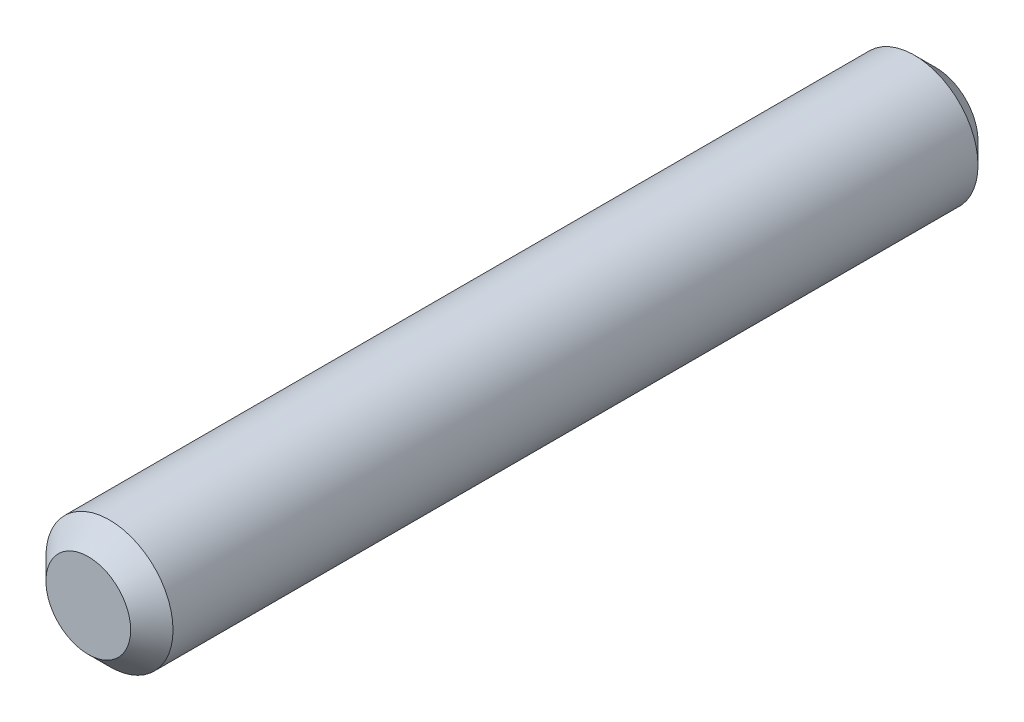
ISO-10303-21;
HEADER;
FILE_DESCRIPTION(('STEP AP214'),'2;1');
FILE_NAME('part.step','',(''),(''),'','','');
FILE_SCHEMA(('AUTOMOTIVE_DESIGN { 1 0 10303 214 1 1 1 1 }'));
ENDSEC;
DATA;
#1=APPLICATION_CONTEXT('core data for automotive mechanical design processes');
#2=APPLICATION_PROTOCOL_DEFINITION('international standard','automotive_design',2000,#1);
#3=PRODUCT_CONTEXT('',#1,'mechanical');
#4=PRODUCT('Part','Part','',(#3));
#5=PRODUCT_RELATED_PRODUCT_CATEGORY('part','',(#4));
#6=PRODUCT_DEFINITION_FORMATION('','',#4);
#7=PRODUCT_DEFINITION_CONTEXT('part definition',#1,'design');
#8=PRODUCT_DEFINITION('design','',#6,#7);
#9=PRODUCT_DEFINITION_SHAPE('','',#8);
#10=(LENGTH_UNIT() NAMED_UNIT(*) SI_UNIT(.MILLI.,.METRE.));
#11=(NAMED_UNIT(*) PLANE_ANGLE_UNIT() SI_UNIT($,.RADIAN.));
#12=(NAMED_UNIT(*) SI_UNIT($,.STERADIAN.) SOLID_ANGLE_UNIT());
#13=UNCERTAINTY_MEASURE_WITH_UNIT(LENGTH_MEASURE(1.E-05),#10,'distance_accuracy_value','');
#14=(GEOMETRIC_REPRESENTATION_CONTEXT(3) GLOBAL_UNCERTAINTY_ASSIGNED_CONTEXT((#13)) GLOBAL_UNIT_ASSIGNED_CONTEXT((#10,
#11,#12)) REPRESENTATION_CONTEXT('',''));
#15=CARTESIAN_POINT('',(0.,0.,0.));
#16=DIRECTION('',(0.,0.,1.));
#17=DIRECTION('',(1.,0.,0.));
#18=AXIS2_PLACEMENT_3D('',#15,#16,#17);
#19=CARTESIAN_POINT('',(0.,0.,20.));
#20=DIRECTION('',(0.,0.,-1.));
#21=DIRECTION('',(-1.,0.,0.));
#22=AXIS2_PLACEMENT_3D('',#19,#20,#21);
#23=CYLINDRICAL_SURFACE('',#22,3.);
#24=CARTESIAN_POINT('',(0.,0.,-19.));
#25=DIRECTION('',(0.,0.,1.));
#26=DIRECTION('',(1.,0.,0.));
#27=AXIS2_PLACEMENT_3D('',#24,#25,#26);
#28=CIRCLE('',#27,3.);
#29=CARTESIAN_POINT('',(3.,0.,-19.));
#30=VERTEX_POINT('',#29);
#31=EDGE_CURVE('E57',#30,#30,#28,.T.);
#32=ORIENTED_EDGE('',*,*,#31,.T.);
#33=EDGE_LOOP('',(#32));
#34=FACE_BOUND('',#33,.T.);
#35=CARTESIAN_POINT('',(0.,0.,19.));
#36=DIRECTION('',(0.,0.,1.));
#37=DIRECTION('',(1.,0.,0.));
#38=AXIS2_PLACEMENT_3D('',#35,#36,#37);
#39=CIRCLE('',#38,3.);
#40=CARTESIAN_POINT('',(3.,0.,19.));
#41=VERTEX_POINT('',#40);
#42=EDGE_CURVE('E62',#41,#41,#39,.F.);
#43=ORIENTED_EDGE('',*,*,#42,.T.);
#44=EDGE_LOOP('',(#43));
#45=FACE_BOUND('',#44,.T.);
#46=ADVANCED_FACE('F43',(#34,#45),#23,.T.);
#47=CARTESIAN_POINT('',(0.,0.,20.));
#48=DIRECTION('',(0.,0.,1.));
#49=DIRECTION('',(1.,0.,0.));
#50=AXIS2_PLACEMENT_3D('',#47,#48,#49);
#51=PLANE('',#50);
#52=CARTESIAN_POINT('',(0.,0.,20.));
#53=DIRECTION('',(0.,0.,1.));
#54=DIRECTION('',(1.,0.,0.));
#55=AXIS2_PLACEMENT_3D('',#52,#53,#54);
#56=CIRCLE('',#55,2.);
#57=CARTESIAN_POINT('',(2.,0.,20.));
#58=VERTEX_POINT('',#57);
#59=EDGE_CURVE('E10',#58,#58,#56,.T.);
#60=ORIENTED_EDGE('',*,*,#59,.T.);
#61=EDGE_LOOP('',(#60));
#62=FACE_BOUND('',#61,.T.);
#63=ADVANCED_FACE('F79',(#62),#51,.T.);
#64=CARTESIAN_POINT('',(0.,0.,-20.));
#65=DIRECTION('',(0.,0.,1.));
#66=DIRECTION('',(1.,0.,0.));
#67=AXIS2_PLACEMENT_3D('',#64,#65,#66);
#68=PLANE('',#67);
#69=CARTESIAN_POINT('',(0.,0.,-20.));
#70=DIRECTION('',(0.,0.,1.));
#71=DIRECTION('',(1.,0.,0.));
#72=AXIS2_PLACEMENT_3D('',#69,#70,#71);
#73=CIRCLE('',#72,1.99999999999999);
#74=CARTESIAN_POINT('',(1.99999999999999,0.,-20.));
#75=VERTEX_POINT('',#74);
#76=EDGE_CURVE('E52',#75,#75,#73,.F.);
#77=ORIENTED_EDGE('',*,*,#76,.T.);
#78=EDGE_LOOP('',(#77));
#79=FACE_BOUND('',#78,.T.);
#80=ADVANCED_FACE('F76',(#79),#68,.F.);
#81=CARTESIAN_POINT('',(0.,0.,-19.));
#82=DIRECTION('',(0.,0.,1.));
#83=DIRECTION('',(1.,0.,0.));
#84=AXIS2_PLACEMENT_3D('',#81,#82,#83);
#85=CONICAL_SURFACE('',#84,3.,0.78539816339745);
#86=ORIENTED_EDGE('',*,*,#76,.F.);
#87=EDGE_LOOP('',(#86));
#88=FACE_BOUND('',#87,.T.);
#89=ORIENTED_EDGE('',*,*,#31,.F.);
#90=EDGE_LOOP('',(#89));
#91=FACE_BOUND('',#90,.T.);
#92=ADVANCED_FACE('F72',(#88,#91),#85,.T.);
#93=CARTESIAN_POINT('',(0.,0.,20.));
#94=DIRECTION('',(0.,0.,-1.));
#95=DIRECTION('',(-1.,0.,0.));
#96=AXIS2_PLACEMENT_3D('',#93,#94,#95);
#97=CONICAL_SURFACE('',#96,2.,0.785398163397447);
#98=ORIENTED_EDGE('',*,*,#42,.F.);
#99=EDGE_LOOP('',(#98));
#100=FACE_BOUND('',#99,.T.);
#101=ORIENTED_EDGE('',*,*,#59,.F.);
#102=EDGE_LOOP('',(#101));
#103=FACE_BOUND('',#102,.T.);
#104=ADVANCED_FACE('F46',(#100,#103),#97,.T.);
#105=CLOSED_SHELL('',(#46,#63,#80,#92,#104));
#106=MANIFOLD_SOLID_BREP('B2',#105);
#107=ADVANCED_BREP_SHAPE_REPRESENTATION('',(#18,#106),#14);
#108=SHAPE_DEFINITION_REPRESENTATION(#9,#107);
ENDSEC;
END-ISO-10303-21;
